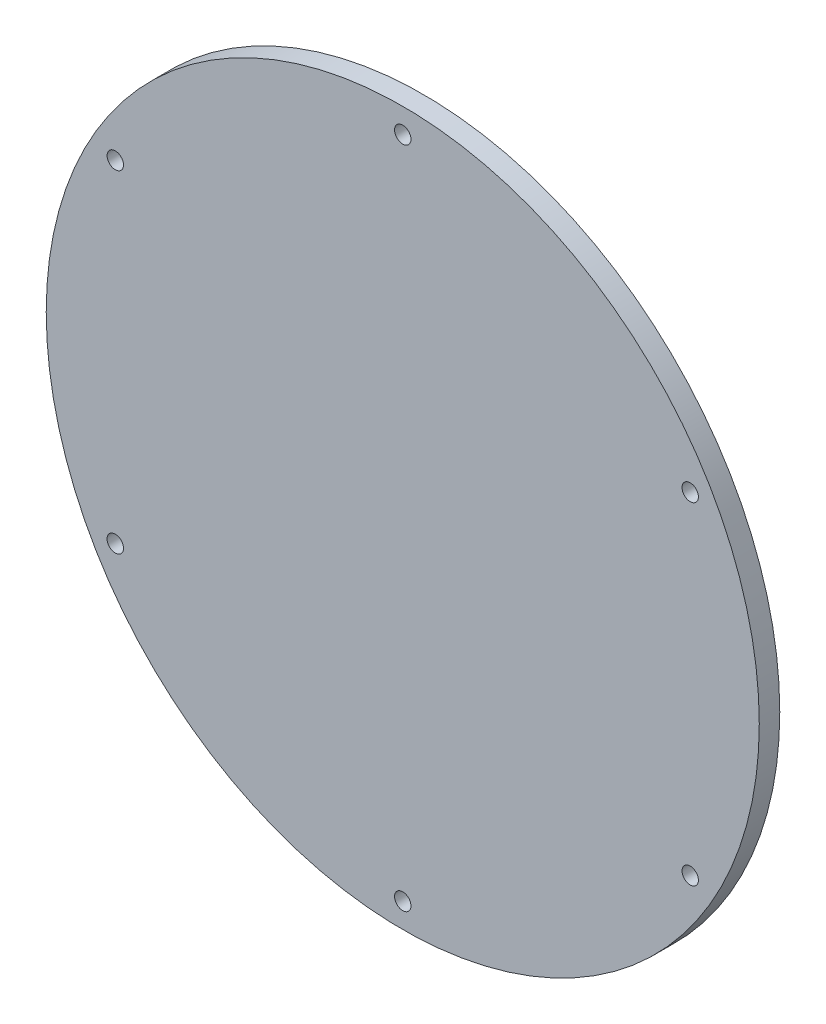
ISO-10303-21;
HEADER;
FILE_DESCRIPTION(('STEP AP214'),'2;1');
FILE_NAME('part.step','',(''),(''),'','','');
FILE_SCHEMA(('AUTOMOTIVE_DESIGN { 1 0 10303 214 1 1 1 1 }'));
ENDSEC;
DATA;
#1=APPLICATION_CONTEXT('core data for automotive mechanical design processes');
#2=APPLICATION_PROTOCOL_DEFINITION('international standard','automotive_design',2000,#1);
#3=PRODUCT_CONTEXT('',#1,'mechanical');
#4=PRODUCT('Part','Part','',(#3));
#5=PRODUCT_RELATED_PRODUCT_CATEGORY('part','',(#4));
#6=PRODUCT_DEFINITION_FORMATION('','',#4);
#7=PRODUCT_DEFINITION_CONTEXT('part definition',#1,'design');
#8=PRODUCT_DEFINITION('design','',#6,#7);
#9=PRODUCT_DEFINITION_SHAPE('','',#8);
#10=(LENGTH_UNIT() NAMED_UNIT(*) SI_UNIT(.MILLI.,.METRE.));
#11=(NAMED_UNIT(*) PLANE_ANGLE_UNIT() SI_UNIT($,.RADIAN.));
#12=(NAMED_UNIT(*) SI_UNIT($,.STERADIAN.) SOLID_ANGLE_UNIT());
#13=UNCERTAINTY_MEASURE_WITH_UNIT(LENGTH_MEASURE(1.E-05),#10,'distance_accuracy_value','');
#14=(GEOMETRIC_REPRESENTATION_CONTEXT(3) GLOBAL_UNCERTAINTY_ASSIGNED_CONTEXT((#13)) GLOBAL_UNIT_ASSIGNED_CONTEXT((#10,
#11,#12)) REPRESENTATION_CONTEXT('',''));
#15=CARTESIAN_POINT('',(0.,0.,0.));
#16=DIRECTION('',(0.,0.,1.));
#17=DIRECTION('',(1.,0.,0.));
#18=AXIS2_PLACEMENT_3D('',#15,#16,#17);
#19=CARTESIAN_POINT('',(0.,0.,10.));
#20=DIRECTION('',(0.,0.,1.));
#21=DIRECTION('',(1.,0.,0.));
#22=AXIS2_PLACEMENT_3D('',#19,#20,#21);
#23=PLANE('',#22);
#24=CARTESIAN_POINT('',(-140.296115413069,-81.000000000006,10.));
#25=DIRECTION('',(0.,0.,1.));
#26=DIRECTION('',(1.,0.,0.));
#27=AXIS2_PLACEMENT_3D('',#24,#25,#26);
#28=CIRCLE('',#27,4.0000000000131);
#29=CARTESIAN_POINT('',(-136.296115413056,-81.000000000006,10.));
#30=VERTEX_POINT('',#29);
#31=EDGE_CURVE('E71',#30,#30,#28,.T.);
#32=ORIENTED_EDGE('',*,*,#31,.F.);
#33=EDGE_LOOP('',(#32));
#34=FACE_BOUND('',#33,.T.);
#35=CARTESIAN_POINT('',(140.296115413089,-80.999999999994,10.));
#36=DIRECTION('',(0.,0.,1.));
#37=DIRECTION('',(1.,0.,0.));
#38=AXIS2_PLACEMENT_3D('',#35,#36,#37);
#39=CIRCLE('',#38,4.00000000000888);
#40=CARTESIAN_POINT('',(144.296115413098,-80.999999999994,10.));
#41=VERTEX_POINT('',#40);
#42=EDGE_CURVE('E59',#41,#41,#39,.T.);
#43=ORIENTED_EDGE('',*,*,#42,.F.);
#44=EDGE_LOOP('',(#43));
#45=FACE_BOUND('',#44,.T.);
#46=CARTESIAN_POINT('',(0.,162.,10.));
#47=DIRECTION('',(0.,0.,1.));
#48=DIRECTION('',(1.,0.,0.));
#49=AXIS2_PLACEMENT_3D('',#46,#47,#48);
#50=CIRCLE('',#49,4.);
#51=CARTESIAN_POINT('',(4.,162.,10.));
#52=VERTEX_POINT('',#51);
#53=EDGE_CURVE('E48',#52,#52,#50,.T.);
#54=ORIENTED_EDGE('',*,*,#53,.F.);
#55=EDGE_LOOP('',(#54));
#56=FACE_BOUND('',#55,.T.);
#57=CARTESIAN_POINT('',(0.,0.,10.));
#58=DIRECTION('',(0.,0.,1.));
#59=DIRECTION('',(1.,0.,0.));
#60=AXIS2_PLACEMENT_3D('',#57,#58,#59);
#61=CIRCLE('',#60,174.);
#62=CARTESIAN_POINT('',(174.,0.,10.));
#63=VERTEX_POINT('',#62);
#64=EDGE_CURVE('E10',#63,#63,#61,.T.);
#65=ORIENTED_EDGE('',*,*,#64,.T.);
#66=EDGE_LOOP('',(#65));
#67=FACE_BOUND('',#66,.T.);
#68=CARTESIAN_POINT('',(140.296115413082,81.000000000006,10.));
#69=DIRECTION('',(0.,0.,1.));
#70=DIRECTION('',(1.,0.,0.));
#71=AXIS2_PLACEMENT_3D('',#68,#69,#70);
#72=CIRCLE('',#71,4.00000000000197);
#73=CARTESIAN_POINT('',(144.296115413084,81.000000000006,10.));
#74=VERTEX_POINT('',#73);
#75=EDGE_CURVE('E53',#74,#74,#72,.T.);
#76=ORIENTED_EDGE('',*,*,#75,.F.);
#77=EDGE_LOOP('',(#76));
#78=FACE_BOUND('',#77,.T.);
#79=CARTESIAN_POINT('',(1.37549025248968E-11,-162.,10.));
#80=DIRECTION('',(0.,0.,1.));
#81=DIRECTION('',(1.,0.,0.));
#82=AXIS2_PLACEMENT_3D('',#79,#80,#81);
#83=CIRCLE('',#82,4.00000000001424);
#84=CARTESIAN_POINT('',(4.00000000002799,-162.,10.));
#85=VERTEX_POINT('',#84);
#86=EDGE_CURVE('E65',#85,#85,#83,.T.);
#87=ORIENTED_EDGE('',*,*,#86,.F.);
#88=EDGE_LOOP('',(#87));
#89=FACE_BOUND('',#88,.T.);
#90=CARTESIAN_POINT('',(-140.296115413076,80.9999999999939,10.));
#91=DIRECTION('',(0.,0.,1.));
#92=DIRECTION('',(1.,0.,0.));
#93=AXIS2_PLACEMENT_3D('',#90,#91,#92);
#94=CIRCLE('',#93,4.00000000000697);
#95=CARTESIAN_POINT('',(-136.296115413069,80.9999999999939,10.));
#96=VERTEX_POINT('',#95);
#97=EDGE_CURVE('E77',#96,#96,#94,.T.);
#98=ORIENTED_EDGE('',*,*,#97,.F.);
#99=EDGE_LOOP('',(#98));
#100=FACE_BOUND('',#99,.T.);
#101=ADVANCED_FACE('F37',(#34,#45,#56,#67,#78,#89,#100),#23,.T.);
#102=CARTESIAN_POINT('',(0.,0.,0.));
#103=DIRECTION('',(0.,0.,1.));
#104=DIRECTION('',(1.,0.,0.));
#105=AXIS2_PLACEMENT_3D('',#102,#103,#104);
#106=PLANE('',#105);
#107=CARTESIAN_POINT('',(0.,0.,0.));
#108=DIRECTION('',(0.,0.,1.));
#109=DIRECTION('',(1.,0.,0.));
#110=AXIS2_PLACEMENT_3D('',#107,#108,#109);
#111=CIRCLE('',#110,174.);
#112=CARTESIAN_POINT('',(174.,0.,0.));
#113=VERTEX_POINT('',#112);
#114=EDGE_CURVE('E41',#113,#113,#111,.T.);
#115=ORIENTED_EDGE('',*,*,#114,.F.);
#116=EDGE_LOOP('',(#115));
#117=FACE_BOUND('',#116,.T.);
#118=CARTESIAN_POINT('',(0.,162.,0.));
#119=DIRECTION('',(0.,0.,1.));
#120=DIRECTION('',(1.,0.,0.));
#121=AXIS2_PLACEMENT_3D('',#118,#119,#120);
#122=CIRCLE('',#121,4.);
#123=CARTESIAN_POINT('',(4.,162.,0.));
#124=VERTEX_POINT('',#123);
#125=EDGE_CURVE('E50',#124,#124,#122,.T.);
#126=ORIENTED_EDGE('',*,*,#125,.T.);
#127=EDGE_LOOP('',(#126));
#128=FACE_BOUND('',#127,.T.);
#129=CARTESIAN_POINT('',(140.296115413082,81.000000000006,0.));
#130=DIRECTION('',(0.,0.,1.));
#131=DIRECTION('',(1.,0.,0.));
#132=AXIS2_PLACEMENT_3D('',#129,#130,#131);
#133=CIRCLE('',#132,4.00000000000197);
#134=CARTESIAN_POINT('',(144.296115413084,81.000000000006,0.));
#135=VERTEX_POINT('',#134);
#136=EDGE_CURVE('E56',#135,#135,#133,.T.);
#137=ORIENTED_EDGE('',*,*,#136,.T.);
#138=EDGE_LOOP('',(#137));
#139=FACE_BOUND('',#138,.T.);
#140=CARTESIAN_POINT('',(140.296115413089,-80.999999999994,0.));
#141=DIRECTION('',(0.,0.,1.));
#142=DIRECTION('',(1.,0.,0.));
#143=AXIS2_PLACEMENT_3D('',#140,#141,#142);
#144=CIRCLE('',#143,4.00000000000888);
#145=CARTESIAN_POINT('',(144.296115413098,-80.999999999994,0.));
#146=VERTEX_POINT('',#145);
#147=EDGE_CURVE('E62',#146,#146,#144,.T.);
#148=ORIENTED_EDGE('',*,*,#147,.T.);
#149=EDGE_LOOP('',(#148));
#150=FACE_BOUND('',#149,.T.);
#151=CARTESIAN_POINT('',(1.37549025248968E-11,-162.,0.));
#152=DIRECTION('',(0.,0.,1.));
#153=DIRECTION('',(1.,0.,0.));
#154=AXIS2_PLACEMENT_3D('',#151,#152,#153);
#155=CIRCLE('',#154,4.00000000001424);
#156=CARTESIAN_POINT('',(4.00000000002799,-162.,0.));
#157=VERTEX_POINT('',#156);
#158=EDGE_CURVE('E68',#157,#157,#155,.T.);
#159=ORIENTED_EDGE('',*,*,#158,.T.);
#160=EDGE_LOOP('',(#159));
#161=FACE_BOUND('',#160,.T.);
#162=CARTESIAN_POINT('',(-140.296115413069,-81.000000000006,0.));
#163=DIRECTION('',(0.,0.,1.));
#164=DIRECTION('',(1.,0.,0.));
#165=AXIS2_PLACEMENT_3D('',#162,#163,#164);
#166=CIRCLE('',#165,4.0000000000131);
#167=CARTESIAN_POINT('',(-136.296115413056,-81.000000000006,0.));
#168=VERTEX_POINT('',#167);
#169=EDGE_CURVE('E74',#168,#168,#166,.T.);
#170=ORIENTED_EDGE('',*,*,#169,.T.);
#171=EDGE_LOOP('',(#170));
#172=FACE_BOUND('',#171,.T.);
#173=CARTESIAN_POINT('',(-140.296115413076,80.9999999999939,0.));
#174=DIRECTION('',(0.,0.,1.));
#175=DIRECTION('',(1.,0.,0.));
#176=AXIS2_PLACEMENT_3D('',#173,#174,#175);
#177=CIRCLE('',#176,4.00000000000697);
#178=CARTESIAN_POINT('',(-136.296115413069,80.9999999999939,0.));
#179=VERTEX_POINT('',#178);
#180=EDGE_CURVE('E80',#179,#179,#177,.T.);
#181=ORIENTED_EDGE('',*,*,#180,.T.);
#182=EDGE_LOOP('',(#181));
#183=FACE_BOUND('',#182,.T.);
#184=ADVANCED_FACE('F90',(#117,#128,#139,#150,#161,#172,#183),#106,.F.);
#185=CARTESIAN_POINT('',(0.,0.,10.));
#186=DIRECTION('',(0.,0.,-1.));
#187=DIRECTION('',(-1.,0.,0.));
#188=AXIS2_PLACEMENT_3D('',#185,#186,#187);
#189=CYLINDRICAL_SURFACE('',#188,174.);
#190=ORIENTED_EDGE('',*,*,#64,.F.);
#191=EDGE_LOOP('',(#190));
#192=FACE_BOUND('',#191,.T.);
#193=ORIENTED_EDGE('',*,*,#114,.T.);
#194=EDGE_LOOP('',(#193));
#195=FACE_BOUND('',#194,.T.);
#196=ADVANCED_FACE('F39',(#192,#195),#189,.T.);
#197=CARTESIAN_POINT('',(0.,162.,10.));
#198=DIRECTION('',(0.,0.,-1.));
#199=DIRECTION('',(-1.,0.,0.));
#200=AXIS2_PLACEMENT_3D('',#197,#198,#199);
#201=CYLINDRICAL_SURFACE('',#200,4.);
#202=ORIENTED_EDGE('',*,*,#53,.T.);
#203=EDGE_LOOP('',(#202));
#204=FACE_BOUND('',#203,.T.);
#205=ORIENTED_EDGE('',*,*,#125,.F.);
#206=EDGE_LOOP('',(#205));
#207=FACE_BOUND('',#206,.T.);
#208=ADVANCED_FACE('F100',(#204,#207),#201,.F.);
#209=CARTESIAN_POINT('',(140.296115413082,81.000000000006,10.));
#210=DIRECTION('',(0.,0.,-1.));
#211=DIRECTION('',(-1.,0.,0.));
#212=AXIS2_PLACEMENT_3D('',#209,#210,#211);
#213=CYLINDRICAL_SURFACE('',#212,4.00000000000197);
#214=ORIENTED_EDGE('',*,*,#75,.T.);
#215=EDGE_LOOP('',(#214));
#216=FACE_BOUND('',#215,.T.);
#217=ORIENTED_EDGE('',*,*,#136,.F.);
#218=EDGE_LOOP('',(#217));
#219=FACE_BOUND('',#218,.T.);
#220=ADVANCED_FACE('F103',(#216,#219),#213,.F.);
#221=CARTESIAN_POINT('',(140.296115413089,-80.999999999994,10.));
#222=DIRECTION('',(0.,0.,-1.));
#223=DIRECTION('',(-1.,0.,0.));
#224=AXIS2_PLACEMENT_3D('',#221,#222,#223);
#225=CYLINDRICAL_SURFACE('',#224,4.00000000000888);
#226=ORIENTED_EDGE('',*,*,#42,.T.);
#227=EDGE_LOOP('',(#226));
#228=FACE_BOUND('',#227,.T.);
#229=ORIENTED_EDGE('',*,*,#147,.F.);
#230=EDGE_LOOP('',(#229));
#231=FACE_BOUND('',#230,.T.);
#232=ADVANCED_FACE('F107',(#228,#231),#225,.F.);
#233=CARTESIAN_POINT('',(1.37549025248968E-11,-162.,10.));
#234=DIRECTION('',(0.,0.,-1.));
#235=DIRECTION('',(-1.,0.,0.));
#236=AXIS2_PLACEMENT_3D('',#233,#234,#235);
#237=CYLINDRICAL_SURFACE('',#236,4.00000000001424);
#238=ORIENTED_EDGE('',*,*,#86,.T.);
#239=EDGE_LOOP('',(#238));
#240=FACE_BOUND('',#239,.T.);
#241=ORIENTED_EDGE('',*,*,#158,.F.);
#242=EDGE_LOOP('',(#241));
#243=FACE_BOUND('',#242,.T.);
#244=ADVANCED_FACE('F111',(#240,#243),#237,.F.);
#245=CARTESIAN_POINT('',(-140.296115413069,-81.000000000006,10.));
#246=DIRECTION('',(0.,0.,-1.));
#247=DIRECTION('',(-1.,0.,0.));
#248=AXIS2_PLACEMENT_3D('',#245,#246,#247);
#249=CYLINDRICAL_SURFACE('',#248,4.0000000000131);
#250=ORIENTED_EDGE('',*,*,#31,.T.);
#251=EDGE_LOOP('',(#250));
#252=FACE_BOUND('',#251,.T.);
#253=ORIENTED_EDGE('',*,*,#169,.F.);
#254=EDGE_LOOP('',(#253));
#255=FACE_BOUND('',#254,.T.);
#256=ADVANCED_FACE('F115',(#252,#255),#249,.F.);
#257=CARTESIAN_POINT('',(-140.296115413076,80.9999999999939,10.));
#258=DIRECTION('',(0.,0.,-1.));
#259=DIRECTION('',(-1.,0.,0.));
#260=AXIS2_PLACEMENT_3D('',#257,#258,#259);
#261=CYLINDRICAL_SURFACE('',#260,4.00000000000697);
#262=ORIENTED_EDGE('',*,*,#97,.T.);
#263=EDGE_LOOP('',(#262));
#264=FACE_BOUND('',#263,.T.);
#265=ORIENTED_EDGE('',*,*,#180,.F.);
#266=EDGE_LOOP('',(#265));
#267=FACE_BOUND('',#266,.T.);
#268=ADVANCED_FACE('F86',(#264,#267),#261,.F.);
#269=CLOSED_SHELL('',(#101,#184,#196,#208,#220,#232,#244,#256,#268));
#270=MANIFOLD_SOLID_BREP('B2',#269);
#271=ADVANCED_BREP_SHAPE_REPRESENTATION('',(#18,#270),#14);
#272=SHAPE_DEFINITION_REPRESENTATION(#9,#271);
ENDSEC;
END-ISO-10303-21;
